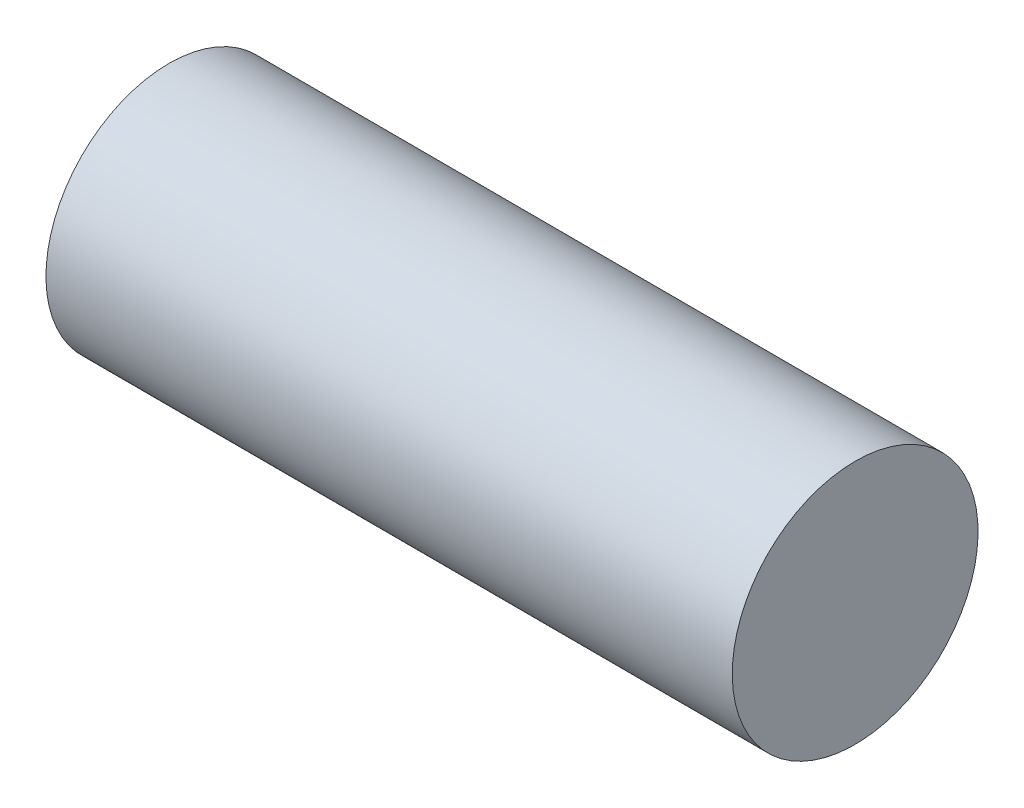
ISO-10303-21;
HEADER;
FILE_DESCRIPTION(('STEP AP214'),'2;1');
FILE_NAME('part.step','',(''),(''),'','','');
FILE_SCHEMA(('AUTOMOTIVE_DESIGN { 1 0 10303 214 1 1 1 1 }'));
ENDSEC;
DATA;
#1=APPLICATION_CONTEXT('core data for automotive mechanical design processes');
#2=APPLICATION_PROTOCOL_DEFINITION('international standard','automotive_design',2000,#1);
#3=PRODUCT_CONTEXT('',#1,'mechanical');
#4=PRODUCT('Part','Part','',(#3));
#5=PRODUCT_RELATED_PRODUCT_CATEGORY('part','',(#4));
#6=PRODUCT_DEFINITION_FORMATION('','',#4);
#7=PRODUCT_DEFINITION_CONTEXT('part definition',#1,'design');
#8=PRODUCT_DEFINITION('design','',#6,#7);
#9=PRODUCT_DEFINITION_SHAPE('','',#8);
#10=(LENGTH_UNIT() NAMED_UNIT(*) SI_UNIT(.MILLI.,.METRE.));
#11=(NAMED_UNIT(*) PLANE_ANGLE_UNIT() SI_UNIT($,.RADIAN.));
#12=(NAMED_UNIT(*) SI_UNIT($,.STERADIAN.) SOLID_ANGLE_UNIT());
#13=UNCERTAINTY_MEASURE_WITH_UNIT(LENGTH_MEASURE(1.E-05),#10,'distance_accuracy_value','');
#14=(GEOMETRIC_REPRESENTATION_CONTEXT(3) GLOBAL_UNCERTAINTY_ASSIGNED_CONTEXT((#13)) GLOBAL_UNIT_ASSIGNED_CONTEXT((#10,
#11,#12)) REPRESENTATION_CONTEXT('',''));
#15=CARTESIAN_POINT('',(0.,0.,0.));
#16=DIRECTION('',(0.,0.,1.));
#17=DIRECTION('',(1.,0.,0.));
#18=AXIS2_PLACEMENT_3D('',#15,#16,#17);
#19=CARTESIAN_POINT('',(-13.558042445128,200.895063597333,163.321797228013));
#20=DIRECTION('',(0.999998204569061,-0.00189495610875852,-1.97778619105628E-09));
#21=DIRECTION('',(0.00189495610875852,0.999998204569061,0.));
#22=AXIS2_PLACEMENT_3D('',#19,#20,#21);
#23=PLANE('',#22);
#24=CARTESIAN_POINT('',(-13.558042445128,200.895063597333,163.321797228013));
#25=DIRECTION('',(0.999998204569061,-0.00189495610875852,-1.97778619105628E-09));
#26=DIRECTION('',(0.00189495610875852,0.999998204569061,0.));
#27=AXIS2_PLACEMENT_3D('',#24,#25,#26);
#28=CIRCLE('',#27,4.69900000000001);
#29=CARTESIAN_POINT('',(-13.549138046373,205.594055160603,163.321797228013));
#30=VERTEX_POINT('',#29);
#31=EDGE_CURVE('E45',#30,#30,#28,.T.);
#32=ORIENTED_EDGE('',*,*,#31,.F.);
#33=EDGE_LOOP('',(#32));
#34=FACE_BOUND('',#33,.T.);
#35=ADVANCED_FACE('F39',(#34),#23,.F.);
#36=CARTESIAN_POINT('',(12.6858057643382,200.845332567562,163.321797176108));
#37=DIRECTION('',(0.999998204569061,-0.00189495610875852,-1.97778619105628E-09));
#38=DIRECTION('',(0.00189495610875852,0.999998204569061,0.));
#39=AXIS2_PLACEMENT_3D('',#36,#37,#38);
#40=PLANE('',#39);
#41=CARTESIAN_POINT('',(12.6858057643382,200.845332567562,163.321797176108));
#42=DIRECTION('',(0.999998204569061,-0.00189495610875852,-1.97778619105628E-09));
#43=DIRECTION('',(0.00189495610875852,0.999998204569061,0.));
#44=AXIS2_PLACEMENT_3D('',#41,#42,#43);
#45=CIRCLE('',#44,4.69900000000001);
#46=CARTESIAN_POINT('',(12.6947101630933,205.544324130832,163.321797176108));
#47=VERTEX_POINT('',#46);
#48=EDGE_CURVE('E11',#47,#47,#45,.T.);
#49=ORIENTED_EDGE('',*,*,#48,.T.);
#50=EDGE_LOOP('',(#49));
#51=FACE_BOUND('',#50,.T.);
#52=ADVANCED_FACE('F54',(#51),#40,.T.);
#53=CARTESIAN_POINT('',(-13.558042445128,200.895063597333,163.321797228013));
#54=DIRECTION('',(0.999998204569061,-0.00189495610875641,-1.97778301825263E-09));
#55=DIRECTION('',(0.00189495610875641,0.999998204569061,0.));
#56=AXIS2_PLACEMENT_3D('',#53,#54,#55);
#57=CYLINDRICAL_SURFACE('',#56,4.69900000000001);
#58=ORIENTED_EDGE('',*,*,#48,.F.);
#59=EDGE_LOOP('',(#58));
#60=FACE_BOUND('',#59,.T.);
#61=ORIENTED_EDGE('',*,*,#31,.T.);
#62=EDGE_LOOP('',(#61));
#63=FACE_BOUND('',#62,.T.);
#64=ADVANCED_FACE('F51',(#60,#63),#57,.T.);
#65=CLOSED_SHELL('',(#35,#52,#64));
#66=MANIFOLD_SOLID_BREP('B2',#65);
#67=ADVANCED_BREP_SHAPE_REPRESENTATION('',(#18,#66),#14);
#68=SHAPE_DEFINITION_REPRESENTATION(#9,#67);
ENDSEC;
END-ISO-10303-21;
